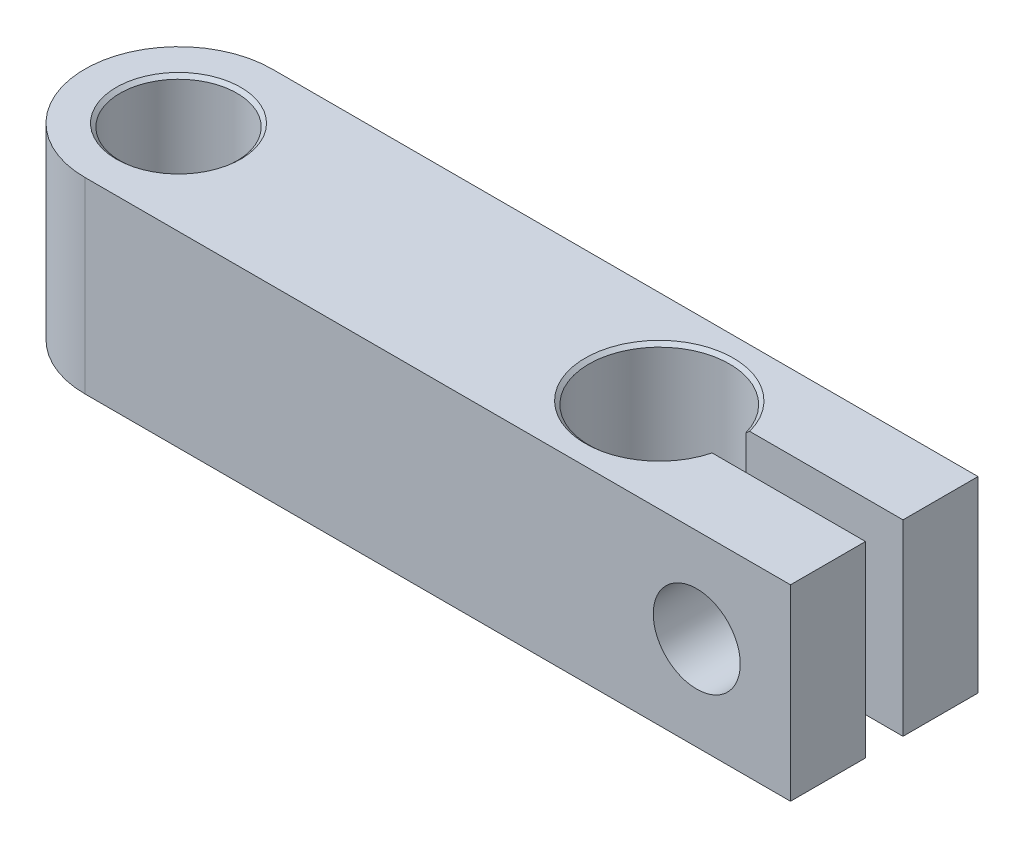
ISO-10303-21;
HEADER;
FILE_DESCRIPTION(('STEP AP214'),'2;1');
FILE_NAME('part.step','',(''),(''),'','','');
FILE_SCHEMA(('AUTOMOTIVE_DESIGN { 1 0 10303 214 1 1 1 1 }'));
ENDSEC;
DATA;
#1=APPLICATION_CONTEXT('core data for automotive mechanical design processes');
#2=APPLICATION_PROTOCOL_DEFINITION('international standard','automotive_design',2000,#1);
#3=PRODUCT_CONTEXT('',#1,'mechanical');
#4=PRODUCT('Part','Part','',(#3));
#5=PRODUCT_RELATED_PRODUCT_CATEGORY('part','',(#4));
#6=PRODUCT_DEFINITION_FORMATION('','',#4);
#7=PRODUCT_DEFINITION_CONTEXT('part definition',#1,'design');
#8=PRODUCT_DEFINITION('design','',#6,#7);
#9=PRODUCT_DEFINITION_SHAPE('','',#8);
#10=(LENGTH_UNIT() NAMED_UNIT(*) SI_UNIT(.MILLI.,.METRE.));
#11=(NAMED_UNIT(*) PLANE_ANGLE_UNIT() SI_UNIT($,.RADIAN.));
#12=(NAMED_UNIT(*) SI_UNIT($,.STERADIAN.) SOLID_ANGLE_UNIT());
#13=UNCERTAINTY_MEASURE_WITH_UNIT(LENGTH_MEASURE(1.E-05),#10,'distance_accuracy_value','');
#14=(GEOMETRIC_REPRESENTATION_CONTEXT(3) GLOBAL_UNCERTAINTY_ASSIGNED_CONTEXT((#13)) GLOBAL_UNIT_ASSIGNED_CONTEXT((#10,
#11,#12)) REPRESENTATION_CONTEXT('',''));
#15=CARTESIAN_POINT('',(0.,0.,0.));
#16=DIRECTION('',(0.,0.,1.));
#17=DIRECTION('',(1.,0.,0.));
#18=AXIS2_PLACEMENT_3D('',#15,#16,#17);
#19=CARTESIAN_POINT('',(16.2814,0.,-3.81));
#20=DIRECTION('',(0.,0.,1.));
#21=DIRECTION('',(1.,0.,0.));
#22=AXIS2_PLACEMENT_3D('',#19,#20,#21);
#23=PLANE('',#22);
#24=DIRECTION('',(0.,-1.,0.));
#25=VECTOR('',#24,1.);
#26=CARTESIAN_POINT('',(18.5764221267997,6.35,-3.81));
#27=LINE('',#26,#25);
#28=CARTESIAN_POINT('',(18.5764221267997,0.126999999999998,-3.81));
#29=VERTEX_POINT('',#28);
#30=CARTESIAN_POINT('',(18.5764221267997,6.23960058429733,-3.81));
#31=VERTEX_POINT('',#30);
#32=EDGE_CURVE('E163',#29,#31,#27,.F.);
#33=ORIENTED_EDGE('',*,*,#32,.F.);
#34=CARTESIAN_POINT('',(18.5764221267997,0.126999999999999,-3.81));
#35=CARTESIAN_POINT('',(18.595498462884,0.105848990005328,-3.81));
#36=CARTESIAN_POINT('',(18.6145661048558,0.0846901516341766,-3.81));
#37=CARTESIAN_POINT('',(18.6526840004289,0.0423568183007242,-3.81));
#38=CARTESIAN_POINT('',(18.6717342540302,0.0211823233385431,-3.81));
#39=CARTESIAN_POINT('',(18.6907758135192,0.,-3.81));
#40=B_SPLINE_CURVE_WITH_KNOTS('',3,(#34,#35,#36,#37,#38,#39),.UNSPECIFIED.,.F.,.F.,(4,2,4),(0.,
0.0854484798240813,0.170896958994931),.UNSPECIFIED.);
#41=CARTESIAN_POINT('',(18.6907758135192,0.,-3.81));
#42=VERTEX_POINT('',#41);
#43=EDGE_CURVE('E228',#29,#42,#40,.T.);
#44=ORIENTED_EDGE('',*,*,#43,.T.);
#45=DIRECTION('',(1.,0.,0.));
#46=VECTOR('',#45,1.);
#47=CARTESIAN_POINT('',(16.2814,0.,-3.81));
#48=LINE('',#47,#46);
#49=CARTESIAN_POINT('',(23.9014,0.,-3.81));
#50=VERTEX_POINT('',#49);
#51=EDGE_CURVE('E124',#42,#50,#48,.T.);
#52=ORIENTED_EDGE('',*,*,#51,.T.);
#53=DIRECTION('',(0.,1.,0.));
#54=VECTOR('',#53,1.);
#55=CARTESIAN_POINT('',(23.9014,0.,-3.81));
#56=LINE('',#55,#54);
#57=CARTESIAN_POINT('',(23.9014,6.35,-3.81));
#58=VERTEX_POINT('',#57);
#59=EDGE_CURVE('E134',#50,#58,#56,.T.);
#60=ORIENTED_EDGE('',*,*,#59,.T.);
#61=DIRECTION('',(1.,0.,0.));
#62=VECTOR('',#61,1.);
#63=CARTESIAN_POINT('',(16.2814,6.35,-3.81));
#64=LINE('',#63,#62);
#65=CARTESIAN_POINT('',(18.7079393181443,6.35,-3.81));
#66=VERTEX_POINT('',#65);
#67=EDGE_CURVE('E125',#66,#58,#64,.T.);
#68=ORIENTED_EDGE('',*,*,#67,.F.);
#69=CARTESIAN_POINT('',(18.7079393181443,6.35,-3.81));
#70=CARTESIAN_POINT('',(18.6860368258918,6.33157979856161,-3.81));
#71=CARTESIAN_POINT('',(18.6641258138813,6.31316974658503,-3.81));
#72=CARTESIAN_POINT('',(18.6202867501,6.27636994135059,-3.81));
#73=CARTESIAN_POINT('',(18.5983586983289,6.25798018809294,-3.81));
#74=CARTESIAN_POINT('',(18.5764221267997,6.23960058429734,-3.81));
#75=B_SPLINE_CURVE_WITH_KNOTS('',3,(#69,#70,#71,#72,#73,#74),.UNSPECIFIED.,.F.,.F.,(4,2,4),(0.,
0.0858557054012549,0.171711411758761),.UNSPECIFIED.);
#76=EDGE_CURVE('E57',#66,#31,#75,.T.);
#77=ORIENTED_EDGE('',*,*,#76,.T.);
#78=EDGE_LOOP('',(#33,#44,#52,#60,#68,#77));
#79=FACE_BOUND('',#78,.T.);
#80=CARTESIAN_POINT('',(20.7264,3.175,-3.81));
#81=DIRECTION('',(0.,0.,1.));
#82=DIRECTION('',(1.,0.,0.));
#83=AXIS2_PLACEMENT_3D('',#80,#81,#82);
#84=CIRCLE('',#83,1.1303);
#85=CARTESIAN_POINT('',(21.8567,3.175,-3.81));
#86=VERTEX_POINT('',#85);
#87=EDGE_CURVE('E265',#86,#86,#84,.F.);
#88=ORIENTED_EDGE('',*,*,#87,.T.);
#89=EDGE_LOOP('',(#88));
#90=FACE_BOUND('',#89,.T.);
#91=ADVANCED_FACE('F37',(#79,#90),#23,.T.);
#92=CARTESIAN_POINT('',(0.,6.35,-3.175));
#93=DIRECTION('',(0.,1.,0.));
#94=DIRECTION('',(0.,0.,1.));
#95=AXIS2_PLACEMENT_3D('',#92,#93,#94);
#96=PLANE('',#95);
#97=CARTESIAN_POINT('',(0.,6.35,-3.175));
#98=DIRECTION('',(0.,1.,0.));
#99=DIRECTION('',(0.,0.,1.));
#100=AXIS2_PLACEMENT_3D('',#97,#98,#99);
#101=CIRCLE('',#100,2.1082);
#102=CARTESIAN_POINT('',(0.,6.35,-1.0668));
#103=VERTEX_POINT('',#102);
#104=EDGE_CURVE('E45',#103,#103,#101,.F.);
#105=ORIENTED_EDGE('',*,*,#104,.T.);
#106=EDGE_LOOP('',(#105));
#107=FACE_BOUND('',#106,.T.);
#108=DIRECTION('',(1.,0.,0.));
#109=VECTOR('',#108,1.);
#110=CARTESIAN_POINT('',(16.2814,6.35,-2.54));
#111=LINE('',#110,#109);
#112=CARTESIAN_POINT('',(18.7079393181443,6.35,-2.54));
#113=VERTEX_POINT('',#112);
#114=CARTESIAN_POINT('',(23.9014,6.35,-2.54000000000001));
#115=VERTEX_POINT('',#114);
#116=EDGE_CURVE('E130',#113,#115,#111,.T.);
#117=ORIENTED_EDGE('',*,*,#116,.F.);
#118=CARTESIAN_POINT('',(16.2814,6.35,-3.175));
#119=DIRECTION('',(0.,1.,0.));
#120=DIRECTION('',(0.,0.,1.));
#121=AXIS2_PLACEMENT_3D('',#118,#119,#120);
#122=CIRCLE('',#121,2.50825000000001);
#123=EDGE_CURVE('E11',#113,#66,#122,.F.);
#124=ORIENTED_EDGE('',*,*,#123,.T.);
#125=ORIENTED_EDGE('',*,*,#67,.T.);
#126=DIRECTION('',(0.,0.,-1.));
#127=VECTOR('',#126,1.);
#128=CARTESIAN_POINT('',(23.9014,6.35,0.));
#129=LINE('',#128,#127);
#130=CARTESIAN_POINT('',(23.9014,6.35,-6.35000000000001));
#131=VERTEX_POINT('',#130);
#132=EDGE_CURVE('E283',#58,#131,#129,.T.);
#133=ORIENTED_EDGE('',*,*,#132,.T.);
#134=DIRECTION('',(-1.,0.,0.));
#135=VECTOR('',#134,1.);
#136=CARTESIAN_POINT('',(0.,6.35,-6.35));
#137=LINE('',#136,#135);
#138=CARTESIAN_POINT('',(0.,6.35,-6.35));
#139=VERTEX_POINT('',#138);
#140=EDGE_CURVE('E153',#131,#139,#137,.T.);
#141=ORIENTED_EDGE('',*,*,#140,.T.);
#142=CARTESIAN_POINT('',(0.,6.35,-3.175));
#143=DIRECTION('',(0.,1.,0.));
#144=DIRECTION('',(0.,0.,1.));
#145=AXIS2_PLACEMENT_3D('',#142,#143,#144);
#146=CIRCLE('',#145,3.175);
#147=CARTESIAN_POINT('',(0.,6.35,0.));
#148=VERTEX_POINT('',#147);
#149=EDGE_CURVE('E143',#139,#148,#146,.T.);
#150=ORIENTED_EDGE('',*,*,#149,.T.);
#151=DIRECTION('',(1.,0.,0.));
#152=VECTOR('',#151,1.);
#153=CARTESIAN_POINT('',(0.,6.35,0.));
#154=LINE('',#153,#152);
#155=CARTESIAN_POINT('',(23.9014,6.35,0.));
#156=VERTEX_POINT('',#155);
#157=EDGE_CURVE('E281',#148,#156,#154,.T.);
#158=ORIENTED_EDGE('',*,*,#157,.T.);
#159=EDGE_CURVE('E284',#156,#115,#129,.T.);
#160=ORIENTED_EDGE('',*,*,#159,.T.);
#161=EDGE_LOOP('',(#117,#124,#125,#133,#141,#150,#158,#160));
#162=FACE_BOUND('',#161,.T.);
#163=ADVANCED_FACE('F204',(#107,#162),#96,.T.);
#164=CARTESIAN_POINT('',(0.,0.,-3.175));
#165=DIRECTION('',(0.,1.,0.));
#166=DIRECTION('',(0.,0.,1.));
#167=AXIS2_PLACEMENT_3D('',#164,#165,#166);
#168=PLANE('',#167);
#169=CARTESIAN_POINT('',(0.,0.,-3.175));
#170=DIRECTION('',(0.,1.,0.));
#171=DIRECTION('',(0.,0.,1.));
#172=AXIS2_PLACEMENT_3D('',#169,#170,#171);
#173=CIRCLE('',#172,2.09159941570266);
#174=CARTESIAN_POINT('',(0.,0.,-1.08340058429734));
#175=VERTEX_POINT('',#174);
#176=EDGE_CURVE('E165',#175,#175,#173,.T.);
#177=ORIENTED_EDGE('',*,*,#176,.T.);
#178=EDGE_LOOP('',(#177));
#179=FACE_BOUND('',#178,.T.);
#180=ORIENTED_EDGE('',*,*,#51,.F.);
#181=CARTESIAN_POINT('',(16.2814,0.,-3.175));
#182=DIRECTION('',(0.,1.,0.));
#183=DIRECTION('',(0.,0.,1.));
#184=AXIS2_PLACEMENT_3D('',#181,#182,#183);
#185=CIRCLE('',#184,2.49164941570266);
#186=CARTESIAN_POINT('',(18.6907758135192,0.,-2.54));
#187=VERTEX_POINT('',#186);
#188=EDGE_CURVE('E122',#42,#187,#185,.T.);
#189=ORIENTED_EDGE('',*,*,#188,.T.);
#190=DIRECTION('',(1.,0.,0.));
#191=VECTOR('',#190,1.);
#192=CARTESIAN_POINT('',(16.2814,0.,-2.54));
#193=LINE('',#192,#191);
#194=CARTESIAN_POINT('',(23.9014,0.,-2.54000000000001));
#195=VERTEX_POINT('',#194);
#196=EDGE_CURVE('E115',#187,#195,#193,.T.);
#197=ORIENTED_EDGE('',*,*,#196,.T.);
#198=DIRECTION('',(0.,0.,-1.));
#199=VECTOR('',#198,1.);
#200=CARTESIAN_POINT('',(23.9014,0.,0.));
#201=LINE('',#200,#199);
#202=CARTESIAN_POINT('',(23.9014,0.,0.));
#203=VERTEX_POINT('',#202);
#204=EDGE_CURVE('E120',#203,#195,#201,.T.);
#205=ORIENTED_EDGE('',*,*,#204,.F.);
#206=DIRECTION('',(1.,0.,0.));
#207=VECTOR('',#206,1.);
#208=CARTESIAN_POINT('',(0.,0.,0.));
#209=LINE('',#208,#207);
#210=CARTESIAN_POINT('',(0.,0.,0.));
#211=VERTEX_POINT('',#210);
#212=EDGE_CURVE('E145',#211,#203,#209,.T.);
#213=ORIENTED_EDGE('',*,*,#212,.F.);
#214=CARTESIAN_POINT('',(0.,0.,-3.175));
#215=DIRECTION('',(0.,1.,0.));
#216=DIRECTION('',(0.,0.,1.));
#217=AXIS2_PLACEMENT_3D('',#214,#215,#216);
#218=CIRCLE('',#217,3.175);
#219=CARTESIAN_POINT('',(0.,0.,-6.35));
#220=VERTEX_POINT('',#219);
#221=EDGE_CURVE('E277',#220,#211,#218,.T.);
#222=ORIENTED_EDGE('',*,*,#221,.F.);
#223=DIRECTION('',(-1.,0.,0.));
#224=VECTOR('',#223,1.);
#225=CARTESIAN_POINT('',(0.,0.,-6.35));
#226=LINE('',#225,#224);
#227=CARTESIAN_POINT('',(23.9014,0.,-6.35000000000001));
#228=VERTEX_POINT('',#227);
#229=EDGE_CURVE('E140',#228,#220,#226,.T.);
#230=ORIENTED_EDGE('',*,*,#229,.F.);
#231=EDGE_CURVE('E141',#50,#228,#201,.T.);
#232=ORIENTED_EDGE('',*,*,#231,.F.);
#233=EDGE_LOOP('',(#180,#189,#197,#205,#213,#222,#230,#232));
#234=FACE_BOUND('',#233,.T.);
#235=ADVANCED_FACE('F118',(#179,#234),#168,.F.);
#236=CARTESIAN_POINT('',(23.9014,6.35,0.));
#237=DIRECTION('',(-1.,0.,0.));
#238=DIRECTION('',(0.,0.,1.));
#239=AXIS2_PLACEMENT_3D('',#236,#237,#238);
#240=PLANE('',#239);
#241=ORIENTED_EDGE('',*,*,#59,.F.);
#242=ORIENTED_EDGE('',*,*,#231,.T.);
#243=DIRECTION('',(0.,-1.,0.));
#244=VECTOR('',#243,1.);
#245=CARTESIAN_POINT('',(23.9014,6.35,-6.35000000000001));
#246=LINE('',#245,#244);
#247=EDGE_CURVE('E152',#131,#228,#246,.T.);
#248=ORIENTED_EDGE('',*,*,#247,.F.);
#249=ORIENTED_EDGE('',*,*,#132,.F.);
#250=EDGE_LOOP('',(#241,#242,#248,#249));
#251=FACE_BOUND('',#250,.T.);
#252=ADVANCED_FACE('F198',(#251),#240,.F.);
#253=CARTESIAN_POINT('',(16.2814,6.35,-3.175));
#254=DIRECTION('',(0.,-1.,0.));
#255=DIRECTION('',(0.,0.,-1.));
#256=AXIS2_PLACEMENT_3D('',#253,#254,#255);
#257=CYLINDRICAL_SURFACE('',#256,2.38125);
#258=DIRECTION('',(0.,-1.,0.));
#259=VECTOR('',#258,1.);
#260=CARTESIAN_POINT('',(18.5764221267997,6.35,-2.54));
#261=LINE('',#260,#259);
#262=CARTESIAN_POINT('',(18.5764221267997,0.126999999999999,-2.54));
#263=VERTEX_POINT('',#262);
#264=CARTESIAN_POINT('',(18.5764221267997,6.23960058429733,-2.54));
#265=VERTEX_POINT('',#264);
#266=EDGE_CURVE('E160',#263,#265,#261,.F.);
#267=ORIENTED_EDGE('',*,*,#266,.F.);
#268=CARTESIAN_POINT('',(16.2814,0.126999999999999,-3.175));
#269=DIRECTION('',(0.,1.,0.));
#270=DIRECTION('',(0.,0.,1.));
#271=AXIS2_PLACEMENT_3D('',#268,#269,#270);
#272=CIRCLE('',#271,2.38125);
#273=EDGE_CURVE('E301',#263,#29,#272,.F.);
#274=ORIENTED_EDGE('',*,*,#273,.T.);
#275=ORIENTED_EDGE('',*,*,#32,.T.);
#276=CARTESIAN_POINT('',(16.2814,6.23960058429733,-3.175));
#277=DIRECTION('',(0.,1.,0.));
#278=DIRECTION('',(0.,0.,1.));
#279=AXIS2_PLACEMENT_3D('',#276,#277,#278);
#280=CIRCLE('',#279,2.38125);
#281=EDGE_CURVE('E303',#31,#265,#280,.T.);
#282=ORIENTED_EDGE('',*,*,#281,.T.);
#283=EDGE_LOOP('',(#267,#274,#275,#282));
#284=FACE_BOUND('',#283,.T.);
#285=ADVANCED_FACE('F193',(#284),#257,.F.);
#286=CARTESIAN_POINT('',(0.,6.35,-3.175));
#287=DIRECTION('',(0.,-1.,0.));
#288=DIRECTION('',(0.,0.,-1.));
#289=AXIS2_PLACEMENT_3D('',#286,#287,#288);
#290=CYLINDRICAL_SURFACE('',#289,3.175);
#291=ORIENTED_EDGE('',*,*,#221,.T.);
#292=DIRECTION('',(0.,-1.,0.));
#293=VECTOR('',#292,1.);
#294=CARTESIAN_POINT('',(0.,6.35,0.));
#295=LINE('',#294,#293);
#296=EDGE_CURVE('E157',#148,#211,#295,.T.);
#297=ORIENTED_EDGE('',*,*,#296,.F.);
#298=ORIENTED_EDGE('',*,*,#149,.F.);
#299=DIRECTION('',(0.,-1.,0.));
#300=VECTOR('',#299,1.);
#301=CARTESIAN_POINT('',(0.,6.35,-6.35));
#302=LINE('',#301,#300);
#303=EDGE_CURVE('E149',#139,#220,#302,.T.);
#304=ORIENTED_EDGE('',*,*,#303,.T.);
#305=EDGE_LOOP('',(#291,#297,#298,#304));
#306=FACE_BOUND('',#305,.T.);
#307=ADVANCED_FACE('F197',(#306),#290,.T.);
#308=CARTESIAN_POINT('',(0.,6.35,0.));
#309=DIRECTION('',(0.,0.,-1.));
#310=DIRECTION('',(-1.,0.,0.));
#311=AXIS2_PLACEMENT_3D('',#308,#309,#310);
#312=PLANE('',#311);
#313=CARTESIAN_POINT('',(20.7264,3.175,0.));
#314=DIRECTION('',(0.,0.,1.));
#315=DIRECTION('',(1.,0.,0.));
#316=AXIS2_PLACEMENT_3D('',#313,#314,#315);
#317=CIRCLE('',#316,1.4732);
#318=CARTESIAN_POINT('',(22.1996,3.175,0.));
#319=VERTEX_POINT('',#318);
#320=EDGE_CURVE('E388',#319,#319,#317,.T.);
#321=ORIENTED_EDGE('',*,*,#320,.F.);
#322=EDGE_LOOP('',(#321));
#323=FACE_BOUND('',#322,.T.);
#324=ORIENTED_EDGE('',*,*,#212,.T.);
#325=DIRECTION('',(0.,-1.,0.));
#326=VECTOR('',#325,1.);
#327=CARTESIAN_POINT('',(23.9014,6.35,0.));
#328=LINE('',#327,#326);
#329=EDGE_CURVE('E139',#156,#203,#328,.T.);
#330=ORIENTED_EDGE('',*,*,#329,.F.);
#331=ORIENTED_EDGE('',*,*,#157,.F.);
#332=ORIENTED_EDGE('',*,*,#296,.T.);
#333=EDGE_LOOP('',(#324,#330,#331,#332));
#334=FACE_BOUND('',#333,.T.);
#335=ADVANCED_FACE('F216',(#323,#334),#312,.F.);
#336=ORIENTED_EDGE('',*,*,#204,.T.);
#337=DIRECTION('',(0.,1.,0.));
#338=VECTOR('',#337,1.);
#339=CARTESIAN_POINT('',(23.9014,0.,-2.54000000000001));
#340=LINE('',#339,#338);
#341=EDGE_CURVE('E128',#195,#115,#340,.T.);
#342=ORIENTED_EDGE('',*,*,#341,.T.);
#343=ORIENTED_EDGE('',*,*,#159,.F.);
#344=ORIENTED_EDGE('',*,*,#329,.T.);
#345=EDGE_LOOP('',(#336,#342,#343,#344));
#346=FACE_BOUND('',#345,.T.);
#347=ADVANCED_FACE('F137',(#346),#240,.F.);
#348=CARTESIAN_POINT('',(0.,6.35,-6.35));
#349=DIRECTION('',(0.,0.,1.));
#350=DIRECTION('',(1.,0.,0.));
#351=AXIS2_PLACEMENT_3D('',#348,#349,#350);
#352=PLANE('',#351);
#353=CARTESIAN_POINT('',(20.7264,3.175,-6.35));
#354=DIRECTION('',(0.,0.,-1.));
#355=DIRECTION('',(-1.,0.,0.));
#356=AXIS2_PLACEMENT_3D('',#353,#354,#355);
#357=CIRCLE('',#356,1.1303);
#358=CARTESIAN_POINT('',(19.5961,3.175,-6.35));
#359=VERTEX_POINT('',#358);
#360=EDGE_CURVE('E266',#359,#359,#357,.T.);
#361=ORIENTED_EDGE('',*,*,#360,.F.);
#362=EDGE_LOOP('',(#361));
#363=FACE_BOUND('',#362,.T.);
#364=ORIENTED_EDGE('',*,*,#229,.T.);
#365=ORIENTED_EDGE('',*,*,#303,.F.);
#366=ORIENTED_EDGE('',*,*,#140,.F.);
#367=ORIENTED_EDGE('',*,*,#247,.T.);
#368=EDGE_LOOP('',(#364,#365,#366,#367));
#369=FACE_BOUND('',#368,.T.);
#370=ADVANCED_FACE('F202',(#363,#369),#352,.F.);
#371=CARTESIAN_POINT('',(0.,6.35,-3.175));
#372=DIRECTION('',(0.,-1.,0.));
#373=DIRECTION('',(0.,0.,-1.));
#374=AXIS2_PLACEMENT_3D('',#371,#372,#373);
#375=CYLINDRICAL_SURFACE('',#374,1.9812);
#376=CARTESIAN_POINT('',(0.,0.126999999999997,-3.175));
#377=DIRECTION('',(0.,1.,0.));
#378=DIRECTION('',(0.,0.,1.));
#379=AXIS2_PLACEMENT_3D('',#376,#377,#378);
#380=CIRCLE('',#379,1.9812);
#381=CARTESIAN_POINT('',(0.,0.126999999999997,-1.1938));
#382=VERTEX_POINT('',#381);
#383=EDGE_CURVE('E241',#382,#382,#380,.F.);
#384=ORIENTED_EDGE('',*,*,#383,.T.);
#385=EDGE_LOOP('',(#384));
#386=FACE_BOUND('',#385,.T.);
#387=CARTESIAN_POINT('',(0.,6.23960058429734,-3.175));
#388=DIRECTION('',(0.,1.,0.));
#389=DIRECTION('',(0.,0.,1.));
#390=AXIS2_PLACEMENT_3D('',#387,#388,#389);
#391=CIRCLE('',#390,1.9812);
#392=CARTESIAN_POINT('',(0.,6.23960058429734,-1.1938));
#393=VERTEX_POINT('',#392);
#394=EDGE_CURVE('E234',#393,#393,#391,.T.);
#395=ORIENTED_EDGE('',*,*,#394,.T.);
#396=EDGE_LOOP('',(#395));
#397=FACE_BOUND('',#396,.T.);
#398=ADVANCED_FACE('F189',(#386,#397),#375,.F.);
#399=CARTESIAN_POINT('',(16.2814,0.,-2.54));
#400=DIRECTION('',(0.,0.,1.));
#401=DIRECTION('',(1.,0.,0.));
#402=AXIS2_PLACEMENT_3D('',#399,#400,#401);
#403=PLANE('',#402);
#404=CARTESIAN_POINT('',(20.7264,3.175,-2.54));
#405=DIRECTION('',(0.,0.,1.));
#406=DIRECTION('',(1.,0.,0.));
#407=AXIS2_PLACEMENT_3D('',#404,#405,#406);
#408=CIRCLE('',#407,1.4732);
#409=CARTESIAN_POINT('',(22.1996,3.175,-2.54000000000001));
#410=VERTEX_POINT('',#409);
#411=EDGE_CURVE('E270',#410,#410,#408,.F.);
#412=ORIENTED_EDGE('',*,*,#411,.F.);
#413=EDGE_LOOP('',(#412));
#414=FACE_BOUND('',#413,.T.);
#415=ORIENTED_EDGE('',*,*,#196,.F.);
#416=CARTESIAN_POINT('',(18.6907758135192,0.,-2.54));
#417=CARTESIAN_POINT('',(18.6717342540302,0.021182323338543,-2.54));
#418=CARTESIAN_POINT('',(18.6526840004289,0.0423568183007242,-2.54));
#419=CARTESIAN_POINT('',(18.6145661048558,0.0846901516341767,-2.54));
#420=CARTESIAN_POINT('',(18.595498462884,0.105848990005328,-2.54));
#421=CARTESIAN_POINT('',(18.5764221267997,0.126999999999998,-2.54));
#422=B_SPLINE_CURVE_WITH_KNOTS('',3,(#416,#417,#418,#419,#420,#421),.UNSPECIFIED.,.F.,.F.,(4,2,
4),(0.,0.0854484791708498,0.170896958994931),.UNSPECIFIED.);
#423=EDGE_CURVE('E175',#187,#263,#422,.T.);
#424=ORIENTED_EDGE('',*,*,#423,.T.);
#425=ORIENTED_EDGE('',*,*,#266,.T.);
#426=CARTESIAN_POINT('',(18.5764221267997,6.23960058429733,-2.54));
#427=CARTESIAN_POINT('',(18.5983586983289,6.25798018809294,-2.54));
#428=CARTESIAN_POINT('',(18.6202867501,6.27636994135058,-2.54));
#429=CARTESIAN_POINT('',(18.6641258138813,6.31316974658503,-2.54));
#430=CARTESIAN_POINT('',(18.6860368258918,6.33157979856161,-2.54));
#431=CARTESIAN_POINT('',(18.7079393181443,6.35,-2.54));
#432=B_SPLINE_CURVE_WITH_KNOTS('',3,(#426,#427,#428,#429,#430,#431),.UNSPECIFIED.,.F.,.F.,(4,2,
4),(0.,0.0858557063575063,0.171711411758761),.UNSPECIFIED.);
#433=EDGE_CURVE('E169',#265,#113,#432,.T.);
#434=ORIENTED_EDGE('',*,*,#433,.T.);
#435=ORIENTED_EDGE('',*,*,#116,.T.);
#436=ORIENTED_EDGE('',*,*,#341,.F.);
#437=EDGE_LOOP('',(#415,#424,#425,#434,#435,#436));
#438=FACE_BOUND('',#437,.T.);
#439=ADVANCED_FACE('F129',(#414,#438),#403,.F.);
#440=CARTESIAN_POINT('',(16.2814,0.,-3.175));
#441=DIRECTION('',(0.,-1.,0.));
#442=DIRECTION('',(0.,0.,-1.));
#443=AXIS2_PLACEMENT_3D('',#440,#441,#442);
#444=CONICAL_SURFACE('',#443,2.49164941570266,0.715584993317677);
#445=ORIENTED_EDGE('',*,*,#43,.F.);
#446=ORIENTED_EDGE('',*,*,#273,.F.);
#447=ORIENTED_EDGE('',*,*,#423,.F.);
#448=ORIENTED_EDGE('',*,*,#188,.F.);
#449=EDGE_LOOP('',(#445,#446,#447,#448));
#450=FACE_BOUND('',#449,.T.);
#451=ADVANCED_FACE('F188',(#450),#444,.F.);
#452=CARTESIAN_POINT('',(0.,0.,-3.175));
#453=DIRECTION('',(0.,-1.,0.));
#454=DIRECTION('',(0.,0.,-1.));
#455=AXIS2_PLACEMENT_3D('',#452,#453,#454);
#456=CONICAL_SURFACE('',#455,2.09159941570266,0.715584993317666);
#457=ORIENTED_EDGE('',*,*,#383,.F.);
#458=EDGE_LOOP('',(#457));
#459=FACE_BOUND('',#458,.T.);
#460=ORIENTED_EDGE('',*,*,#176,.F.);
#461=EDGE_LOOP('',(#460));
#462=FACE_BOUND('',#461,.T.);
#463=ADVANCED_FACE('F224',(#459,#462),#456,.F.);
#464=CARTESIAN_POINT('',(16.2814,6.23960058429733,-3.175));
#465=DIRECTION('',(0.,1.,0.));
#466=DIRECTION('',(0.,0.,1.));
#467=AXIS2_PLACEMENT_3D('',#464,#465,#466);
#468=CONICAL_SURFACE('',#467,2.38125,0.855211333477213);
#469=ORIENTED_EDGE('',*,*,#76,.F.);
#470=ORIENTED_EDGE('',*,*,#123,.F.);
#471=ORIENTED_EDGE('',*,*,#433,.F.);
#472=ORIENTED_EDGE('',*,*,#281,.F.);
#473=EDGE_LOOP('',(#469,#470,#471,#472));
#474=FACE_BOUND('',#473,.T.);
#475=ADVANCED_FACE('F181',(#474),#468,.F.);
#476=CARTESIAN_POINT('',(0.,6.23960058429734,-3.175));
#477=DIRECTION('',(0.,1.,0.));
#478=DIRECTION('',(0.,0.,1.));
#479=AXIS2_PLACEMENT_3D('',#476,#477,#478);
#480=CONICAL_SURFACE('',#479,1.9812,0.855211333477222);
#481=ORIENTED_EDGE('',*,*,#104,.F.);
#482=EDGE_LOOP('',(#481));
#483=FACE_BOUND('',#482,.T.);
#484=ORIENTED_EDGE('',*,*,#394,.F.);
#485=EDGE_LOOP('',(#484));
#486=FACE_BOUND('',#485,.T.);
#487=ADVANCED_FACE('F39',(#483,#486),#480,.F.);
#488=CARTESIAN_POINT('',(20.7264,3.175,-6.35));
#489=DIRECTION('',(0.,0.,-1.));
#490=DIRECTION('',(-1.,0.,0.));
#491=AXIS2_PLACEMENT_3D('',#488,#489,#490);
#492=CYLINDRICAL_SURFACE('',#491,1.1303);
#493=ORIENTED_EDGE('',*,*,#87,.F.);
#494=EDGE_LOOP('',(#493));
#495=FACE_BOUND('',#494,.T.);
#496=ORIENTED_EDGE('',*,*,#360,.T.);
#497=EDGE_LOOP('',(#496));
#498=FACE_BOUND('',#497,.T.);
#499=ADVANCED_FACE('F248',(#495,#498),#492,.F.);
#500=CARTESIAN_POINT('',(20.7264,3.175,-6.70683884017609));
#501=DIRECTION('',(0.,0.,1.));
#502=DIRECTION('',(1.,0.,0.));
#503=AXIS2_PLACEMENT_3D('',#500,#501,#502);
#504=CYLINDRICAL_SURFACE('',#503,1.4732);
#505=ORIENTED_EDGE('',*,*,#411,.T.);
#506=EDGE_LOOP('',(#505));
#507=FACE_BOUND('',#506,.T.);
#508=ORIENTED_EDGE('',*,*,#320,.T.);
#509=EDGE_LOOP('',(#508));
#510=FACE_BOUND('',#509,.T.);
#511=ADVANCED_FACE('F255',(#507,#510),#504,.F.);
#512=CLOSED_SHELL('',(#91,#163,#235,#252,#285,#307,#335,#347,#370,#398,#439,#451,#463,#475,#487,
#499,#511));
#513=MANIFOLD_SOLID_BREP('B2',#512);
#514=ADVANCED_BREP_SHAPE_REPRESENTATION('',(#18,#513),#14);
#515=SHAPE_DEFINITION_REPRESENTATION(#9,#514);
ENDSEC;
END-ISO-10303-21;
